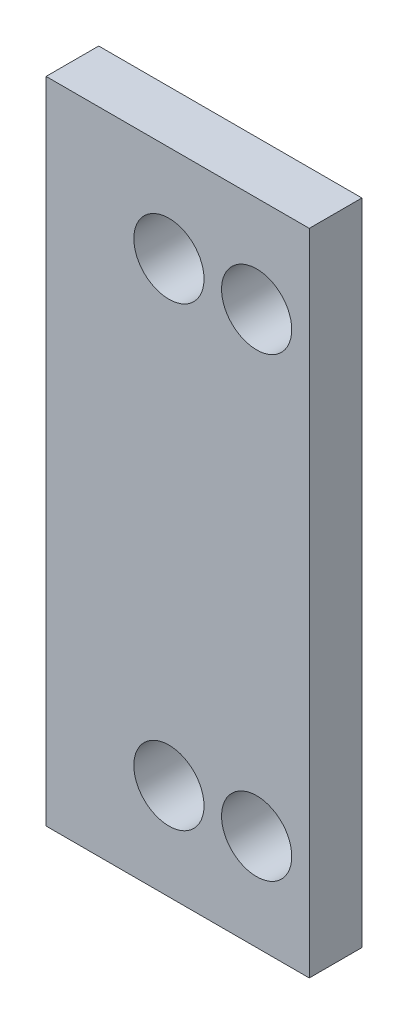
ISO-10303-21;
HEADER;
FILE_DESCRIPTION(('STEP AP214'),'2;1');
FILE_NAME('part.step','',(''),(''),'','','');
FILE_SCHEMA(('AUTOMOTIVE_DESIGN { 1 0 10303 214 1 1 1 1 }'));
ENDSEC;
DATA;
#1=APPLICATION_CONTEXT('core data for automotive mechanical design processes');
#2=APPLICATION_PROTOCOL_DEFINITION('international standard','automotive_design',2000,#1);
#3=PRODUCT_CONTEXT('',#1,'mechanical');
#4=PRODUCT('Part','Part','',(#3));
#5=PRODUCT_RELATED_PRODUCT_CATEGORY('part','',(#4));
#6=PRODUCT_DEFINITION_FORMATION('','',#4);
#7=PRODUCT_DEFINITION_CONTEXT('part definition',#1,'design');
#8=PRODUCT_DEFINITION('design','',#6,#7);
#9=PRODUCT_DEFINITION_SHAPE('','',#8);
#10=(LENGTH_UNIT() NAMED_UNIT(*) SI_UNIT(.MILLI.,.METRE.));
#11=(NAMED_UNIT(*) PLANE_ANGLE_UNIT() SI_UNIT($,.RADIAN.));
#12=(NAMED_UNIT(*) SI_UNIT($,.STERADIAN.) SOLID_ANGLE_UNIT());
#13=UNCERTAINTY_MEASURE_WITH_UNIT(LENGTH_MEASURE(1.E-05),#10,'distance_accuracy_value','');
#14=(GEOMETRIC_REPRESENTATION_CONTEXT(3) GLOBAL_UNCERTAINTY_ASSIGNED_CONTEXT((#13)) GLOBAL_UNIT_ASSIGNED_CONTEXT((#10,
#11,#12)) REPRESENTATION_CONTEXT('',''));
#15=CARTESIAN_POINT('',(0.,0.,0.));
#16=DIRECTION('',(0.,0.,1.));
#17=DIRECTION('',(1.,0.,0.));
#18=AXIS2_PLACEMENT_3D('',#15,#16,#17);
#19=CARTESIAN_POINT('',(0.,0.,3.));
#20=DIRECTION('',(0.,0.,-1.));
#21=DIRECTION('',(-1.,0.,0.));
#22=AXIS2_PLACEMENT_3D('',#19,#20,#21);
#23=PLANE('',#22);
#24=DIRECTION('',(-1.,0.,0.));
#25=VECTOR('',#24,1.);
#26=CARTESIAN_POINT('',(1.3870098228206,-13.0286721920559,3.));
#27=LINE('',#26,#25);
#28=CARTESIAN_POINT('',(8.88700982282061,-13.0286721920559,3.));
#29=VERTEX_POINT('',#28);
#30=CARTESIAN_POINT('',(-6.11299017717939,-13.0286721920559,3.));
#31=VERTEX_POINT('',#30);
#32=EDGE_CURVE('E205',#29,#31,#27,.T.);
#33=ORIENTED_EDGE('',*,*,#32,.F.);
#34=DIRECTION('',(0.,-1.,0.));
#35=VECTOR('',#34,1.);
#36=CARTESIAN_POINT('',(8.8870098228206,23.9713278079441,3.));
#37=LINE('',#36,#35);
#38=CARTESIAN_POINT('',(8.8870098228206,23.9713278079441,3.));
#39=VERTEX_POINT('',#38);
#40=EDGE_CURVE('E170',#39,#29,#37,.T.);
#41=ORIENTED_EDGE('',*,*,#40,.F.);
#42=DIRECTION('',(1.,0.,0.));
#43=VECTOR('',#42,1.);
#44=CARTESIAN_POINT('',(-6.11299017717939,23.9713278079441,3.));
#45=LINE('',#44,#43);
#46=CARTESIAN_POINT('',(-6.11299017717939,23.9713278079441,3.));
#47=VERTEX_POINT('',#46);
#48=EDGE_CURVE('E204',#47,#39,#45,.T.);
#49=ORIENTED_EDGE('',*,*,#48,.F.);
#50=DIRECTION('',(0.,1.,0.));
#51=VECTOR('',#50,1.);
#52=CARTESIAN_POINT('',(-6.11299017717939,-13.0286721920559,3.));
#53=LINE('',#52,#51);
#54=EDGE_CURVE('E196',#31,#47,#53,.T.);
#55=ORIENTED_EDGE('',*,*,#54,.F.);
#56=EDGE_LOOP('',(#33,#41,#49,#55));
#57=FACE_BOUND('',#56,.T.);
#58=CARTESIAN_POINT('',(0.887009822820603,18.4713278079441,3.));
#59=DIRECTION('',(0.,0.,1.));
#60=DIRECTION('',(1.,0.,0.));
#61=AXIS2_PLACEMENT_3D('',#58,#59,#60);
#62=CIRCLE('',#61,2.00000000000001);
#63=CARTESIAN_POINT('',(2.88700982282061,18.4713278079441,3.));
#64=VERTEX_POINT('',#63);
#65=EDGE_CURVE('E222',#64,#64,#62,.T.);
#66=ORIENTED_EDGE('',*,*,#65,.F.);
#67=EDGE_LOOP('',(#66));
#68=FACE_BOUND('',#67,.T.);
#69=CARTESIAN_POINT('',(5.8870098228206,18.4713278079441,3.));
#70=DIRECTION('',(0.,0.,1.));
#71=DIRECTION('',(1.,0.,0.));
#72=AXIS2_PLACEMENT_3D('',#69,#70,#71);
#73=CIRCLE('',#72,2.);
#74=CARTESIAN_POINT('',(7.88700982282061,18.4713278079441,3.));
#75=VERTEX_POINT('',#74);
#76=EDGE_CURVE('E245',#75,#75,#73,.T.);
#77=ORIENTED_EDGE('',*,*,#76,.F.);
#78=EDGE_LOOP('',(#77));
#79=FACE_BOUND('',#78,.T.);
#80=CARTESIAN_POINT('',(5.8870098228206,-7.52867219205591,3.));
#81=DIRECTION('',(0.,0.,1.));
#82=DIRECTION('',(1.,0.,0.));
#83=AXIS2_PLACEMENT_3D('',#80,#81,#82);
#84=CIRCLE('',#83,2.);
#85=CARTESIAN_POINT('',(7.8870098228206,-7.52867219205591,3.));
#86=VERTEX_POINT('',#85);
#87=EDGE_CURVE('E253',#86,#86,#84,.T.);
#88=ORIENTED_EDGE('',*,*,#87,.F.);
#89=EDGE_LOOP('',(#88));
#90=FACE_BOUND('',#89,.T.);
#91=CARTESIAN_POINT('',(0.887009822820602,-7.52867219205591,3.));
#92=DIRECTION('',(0.,0.,1.));
#93=DIRECTION('',(1.,0.,0.));
#94=AXIS2_PLACEMENT_3D('',#91,#92,#93);
#95=CIRCLE('',#94,2.);
#96=CARTESIAN_POINT('',(2.88700982282061,-7.52867219205591,3.));
#97=VERTEX_POINT('',#96);
#98=EDGE_CURVE('E261',#97,#97,#95,.T.);
#99=ORIENTED_EDGE('',*,*,#98,.F.);
#100=EDGE_LOOP('',(#99));
#101=FACE_BOUND('',#100,.T.);
#102=ADVANCED_FACE('F151',(#57,#68,#79,#90,#101),#23,.F.);
#103=CARTESIAN_POINT('',(0.,0.,0.));
#104=DIRECTION('',(0.,0.,-1.));
#105=DIRECTION('',(-1.,0.,0.));
#106=AXIS2_PLACEMENT_3D('',#103,#104,#105);
#107=PLANE('',#106);
#108=CARTESIAN_POINT('',(5.8870098228206,-7.52867219205591,0.));
#109=DIRECTION('',(0.,0.,1.));
#110=DIRECTION('',(1.,0.,0.));
#111=AXIS2_PLACEMENT_3D('',#108,#109,#110);
#112=CIRCLE('',#111,2.);
#113=CARTESIAN_POINT('',(7.8870098228206,-7.52867219205591,0.));
#114=VERTEX_POINT('',#113);
#115=EDGE_CURVE('E257',#114,#114,#112,.T.);
#116=ORIENTED_EDGE('',*,*,#115,.T.);
#117=EDGE_LOOP('',(#116));
#118=FACE_BOUND('',#117,.T.);
#119=CARTESIAN_POINT('',(0.887009822820603,18.4713278079441,0.));
#120=DIRECTION('',(0.,0.,1.));
#121=DIRECTION('',(1.,0.,0.));
#122=AXIS2_PLACEMENT_3D('',#119,#120,#121);
#123=CIRCLE('',#122,2.00000000000001);
#124=CARTESIAN_POINT('',(2.88700982282061,18.4713278079441,0.));
#125=VERTEX_POINT('',#124);
#126=EDGE_CURVE('E241',#125,#125,#123,.T.);
#127=ORIENTED_EDGE('',*,*,#126,.T.);
#128=EDGE_LOOP('',(#127));
#129=FACE_BOUND('',#128,.T.);
#130=DIRECTION('',(-1.,0.,0.));
#131=VECTOR('',#130,1.);
#132=CARTESIAN_POINT('',(8.88700982282061,-13.0286721920559,0.));
#133=LINE('',#132,#131);
#134=CARTESIAN_POINT('',(8.88700982282061,-13.0286721920559,0.));
#135=VERTEX_POINT('',#134);
#136=CARTESIAN_POINT('',(-6.11299017717939,-13.0286721920559,0.));
#137=VERTEX_POINT('',#136);
#138=EDGE_CURVE('E227',#135,#137,#133,.T.);
#139=ORIENTED_EDGE('',*,*,#138,.T.);
#140=DIRECTION('',(0.,1.,0.));
#141=VECTOR('',#140,1.);
#142=CARTESIAN_POINT('',(-6.11299017717939,5.47132780794409,0.));
#143=LINE('',#142,#141);
#144=CARTESIAN_POINT('',(-6.11299017717939,23.9713278079441,0.));
#145=VERTEX_POINT('',#144);
#146=EDGE_CURVE('E219',#137,#145,#143,.T.);
#147=ORIENTED_EDGE('',*,*,#146,.T.);
#148=DIRECTION('',(1.,0.,0.));
#149=VECTOR('',#148,1.);
#150=CARTESIAN_POINT('',(1.3870098228206,23.9713278079441,0.));
#151=LINE('',#150,#149);
#152=CARTESIAN_POINT('',(8.8870098228206,23.9713278079441,0.));
#153=VERTEX_POINT('',#152);
#154=EDGE_CURVE('E210',#145,#153,#151,.T.);
#155=ORIENTED_EDGE('',*,*,#154,.T.);
#156=DIRECTION('',(0.,-1.,0.));
#157=VECTOR('',#156,1.);
#158=CARTESIAN_POINT('',(8.88700982282061,5.47132780794409,0.));
#159=LINE('',#158,#157);
#160=EDGE_CURVE('E185',#153,#135,#159,.T.);
#161=ORIENTED_EDGE('',*,*,#160,.T.);
#162=EDGE_LOOP('',(#139,#147,#155,#161));
#163=FACE_BOUND('',#162,.T.);
#164=CARTESIAN_POINT('',(5.8870098228206,18.4713278079441,0.));
#165=DIRECTION('',(0.,0.,1.));
#166=DIRECTION('',(1.,0.,0.));
#167=AXIS2_PLACEMENT_3D('',#164,#165,#166);
#168=CIRCLE('',#167,2.);
#169=CARTESIAN_POINT('',(7.88700982282061,18.4713278079441,0.));
#170=VERTEX_POINT('',#169);
#171=EDGE_CURVE('E249',#170,#170,#168,.T.);
#172=ORIENTED_EDGE('',*,*,#171,.T.);
#173=EDGE_LOOP('',(#172));
#174=FACE_BOUND('',#173,.T.);
#175=CARTESIAN_POINT('',(0.887009822820602,-7.52867219205591,0.));
#176=DIRECTION('',(0.,0.,1.));
#177=DIRECTION('',(1.,0.,0.));
#178=AXIS2_PLACEMENT_3D('',#175,#176,#177);
#179=CIRCLE('',#178,2.);
#180=CARTESIAN_POINT('',(2.88700982282061,-7.52867219205591,0.));
#181=VERTEX_POINT('',#180);
#182=EDGE_CURVE('E265',#181,#181,#179,.T.);
#183=ORIENTED_EDGE('',*,*,#182,.T.);
#184=EDGE_LOOP('',(#183));
#185=FACE_BOUND('',#184,.T.);
#186=ADVANCED_FACE('F233',(#118,#129,#163,#174,#185),#107,.T.);
#187=CARTESIAN_POINT('',(8.88700982282061,-13.0286721920559,3.));
#188=DIRECTION('',(0.,-1.,0.));
#189=DIRECTION('',(0.,0.,-1.));
#190=AXIS2_PLACEMENT_3D('',#187,#188,#189);
#191=PLANE('',#190);
#192=ORIENTED_EDGE('',*,*,#138,.F.);
#193=DIRECTION('',(0.,0.,-1.));
#194=VECTOR('',#193,1.);
#195=CARTESIAN_POINT('',(8.88700982282061,-13.0286721920559,3.));
#196=LINE('',#195,#194);
#197=EDGE_CURVE('E12',#29,#135,#196,.T.);
#198=ORIENTED_EDGE('',*,*,#197,.F.);
#199=ORIENTED_EDGE('',*,*,#32,.T.);
#200=DIRECTION('',(0.,0.,-1.));
#201=VECTOR('',#200,1.);
#202=CARTESIAN_POINT('',(-6.11299017717939,-13.0286721920559,3.));
#203=LINE('',#202,#201);
#204=EDGE_CURVE('E155',#31,#137,#203,.T.);
#205=ORIENTED_EDGE('',*,*,#204,.T.);
#206=EDGE_LOOP('',(#192,#198,#199,#205));
#207=FACE_BOUND('',#206,.T.);
#208=ADVANCED_FACE('F237',(#207),#191,.T.);
#209=CARTESIAN_POINT('',(8.88700982282061,5.47132780794409,3.));
#210=DIRECTION('',(1.,0.,0.));
#211=DIRECTION('',(0.,0.,-1.));
#212=AXIS2_PLACEMENT_3D('',#209,#210,#211);
#213=PLANE('',#212);
#214=ORIENTED_EDGE('',*,*,#160,.F.);
#215=DIRECTION('',(0.,0.,-1.));
#216=VECTOR('',#215,1.);
#217=CARTESIAN_POINT('',(8.8870098228206,23.9713278079441,3.));
#218=LINE('',#217,#216);
#219=EDGE_CURVE('E162',#39,#153,#218,.T.);
#220=ORIENTED_EDGE('',*,*,#219,.F.);
#221=ORIENTED_EDGE('',*,*,#40,.T.);
#222=ORIENTED_EDGE('',*,*,#197,.T.);
#223=EDGE_LOOP('',(#214,#220,#221,#222));
#224=FACE_BOUND('',#223,.T.);
#225=ADVANCED_FACE('F289',(#224),#213,.T.);
#226=CARTESIAN_POINT('',(1.3870098228206,23.9713278079441,3.));
#227=DIRECTION('',(0.,1.,0.));
#228=DIRECTION('',(0.,0.,1.));
#229=AXIS2_PLACEMENT_3D('',#226,#227,#228);
#230=PLANE('',#229);
#231=ORIENTED_EDGE('',*,*,#154,.F.);
#232=DIRECTION('',(0.,0.,-1.));
#233=VECTOR('',#232,1.);
#234=CARTESIAN_POINT('',(-6.11299017717939,23.9713278079441,3.));
#235=LINE('',#234,#233);
#236=EDGE_CURVE('E198',#47,#145,#235,.T.);
#237=ORIENTED_EDGE('',*,*,#236,.F.);
#238=ORIENTED_EDGE('',*,*,#48,.T.);
#239=ORIENTED_EDGE('',*,*,#219,.T.);
#240=EDGE_LOOP('',(#231,#237,#238,#239));
#241=FACE_BOUND('',#240,.T.);
#242=ADVANCED_FACE('F208',(#241),#230,.T.);
#243=CARTESIAN_POINT('',(-6.11299017717939,5.47132780794409,3.));
#244=DIRECTION('',(-1.,0.,0.));
#245=DIRECTION('',(0.,0.,1.));
#246=AXIS2_PLACEMENT_3D('',#243,#244,#245);
#247=PLANE('',#246);
#248=ORIENTED_EDGE('',*,*,#146,.F.);
#249=ORIENTED_EDGE('',*,*,#204,.F.);
#250=ORIENTED_EDGE('',*,*,#54,.T.);
#251=ORIENTED_EDGE('',*,*,#236,.T.);
#252=EDGE_LOOP('',(#248,#249,#250,#251));
#253=FACE_BOUND('',#252,.T.);
#254=ADVANCED_FACE('F153',(#253),#247,.T.);
#255=CARTESIAN_POINT('',(0.887009822820603,18.4713278079441,3.));
#256=DIRECTION('',(0.,0.,-1.));
#257=DIRECTION('',(-1.,0.,0.));
#258=AXIS2_PLACEMENT_3D('',#255,#256,#257);
#259=CYLINDRICAL_SURFACE('',#258,2.00000000000001);
#260=ORIENTED_EDGE('',*,*,#65,.T.);
#261=EDGE_LOOP('',(#260));
#262=FACE_BOUND('',#261,.T.);
#263=ORIENTED_EDGE('',*,*,#126,.F.);
#264=EDGE_LOOP('',(#263));
#265=FACE_BOUND('',#264,.T.);
#266=ADVANCED_FACE('F284',(#262,#265),#259,.F.);
#267=CARTESIAN_POINT('',(5.8870098228206,18.4713278079441,3.));
#268=DIRECTION('',(0.,0.,-1.));
#269=DIRECTION('',(-1.,0.,0.));
#270=AXIS2_PLACEMENT_3D('',#267,#268,#269);
#271=CYLINDRICAL_SURFACE('',#270,2.);
#272=ORIENTED_EDGE('',*,*,#76,.T.);
#273=EDGE_LOOP('',(#272));
#274=FACE_BOUND('',#273,.T.);
#275=ORIENTED_EDGE('',*,*,#171,.F.);
#276=EDGE_LOOP('',(#275));
#277=FACE_BOUND('',#276,.T.);
#278=ADVANCED_FACE('F298',(#274,#277),#271,.F.);
#279=CARTESIAN_POINT('',(5.8870098228206,-7.52867219205591,3.));
#280=DIRECTION('',(0.,0.,-1.));
#281=DIRECTION('',(-1.,0.,0.));
#282=AXIS2_PLACEMENT_3D('',#279,#280,#281);
#283=CYLINDRICAL_SURFACE('',#282,2.);
#284=ORIENTED_EDGE('',*,*,#87,.T.);
#285=EDGE_LOOP('',(#284));
#286=FACE_BOUND('',#285,.T.);
#287=ORIENTED_EDGE('',*,*,#115,.F.);
#288=EDGE_LOOP('',(#287));
#289=FACE_BOUND('',#288,.T.);
#290=ADVANCED_FACE('F303',(#286,#289),#283,.F.);
#291=CARTESIAN_POINT('',(0.887009822820602,-7.52867219205591,3.));
#292=DIRECTION('',(0.,0.,-1.));
#293=DIRECTION('',(-1.,0.,0.));
#294=AXIS2_PLACEMENT_3D('',#291,#292,#293);
#295=CYLINDRICAL_SURFACE('',#294,2.);
#296=ORIENTED_EDGE('',*,*,#98,.T.);
#297=EDGE_LOOP('',(#296));
#298=FACE_BOUND('',#297,.T.);
#299=ORIENTED_EDGE('',*,*,#182,.F.);
#300=EDGE_LOOP('',(#299));
#301=FACE_BOUND('',#300,.T.);
#302=ADVANCED_FACE('F273',(#298,#301),#295,.F.);
#303=CLOSED_SHELL('',(#102,#186,#208,#225,#242,#254,#266,#278,#290,#302));
#304=MANIFOLD_SOLID_BREP('B2',#303);
#305=ADVANCED_BREP_SHAPE_REPRESENTATION('',(#18,#304),#14);
#306=SHAPE_DEFINITION_REPRESENTATION(#9,#305);
ENDSEC;
END-ISO-10303-21;
